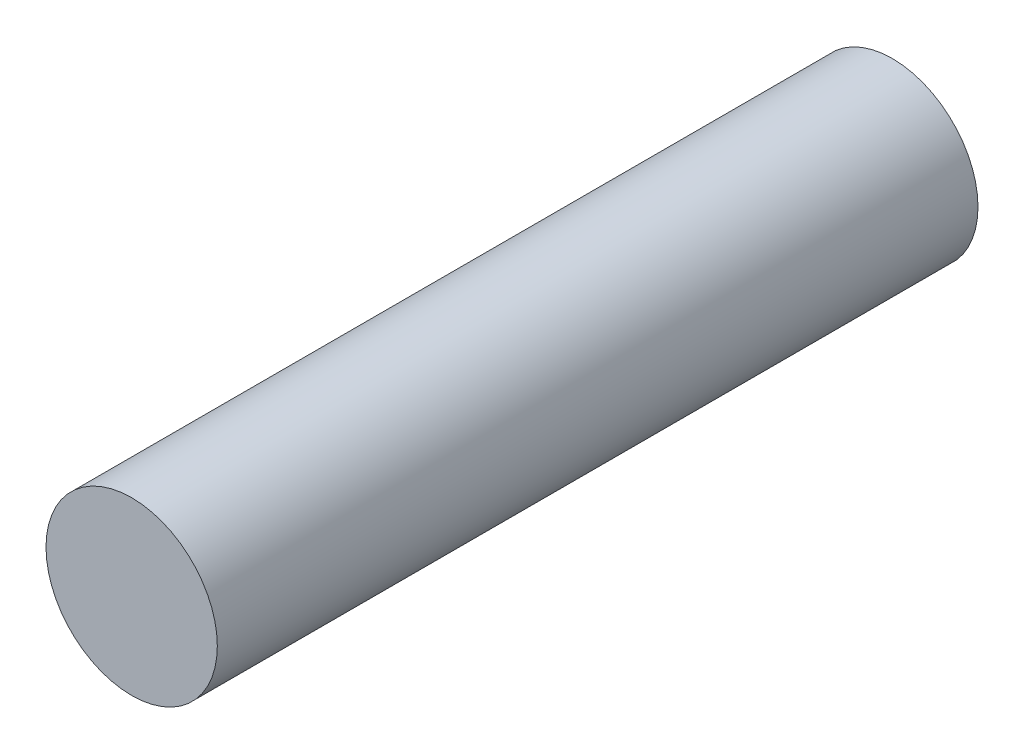
ISO-10303-21;
HEADER;
FILE_DESCRIPTION(('STEP AP214'),'2;1');
FILE_NAME('part.step','',(''),(''),'','','');
FILE_SCHEMA(('AUTOMOTIVE_DESIGN { 1 0 10303 214 1 1 1 1 }'));
ENDSEC;
DATA;
#1=APPLICATION_CONTEXT('core data for automotive mechanical design processes');
#2=APPLICATION_PROTOCOL_DEFINITION('international standard','automotive_design',2000,#1);
#3=PRODUCT_CONTEXT('',#1,'mechanical');
#4=PRODUCT('Part','Part','',(#3));
#5=PRODUCT_RELATED_PRODUCT_CATEGORY('part','',(#4));
#6=PRODUCT_DEFINITION_FORMATION('','',#4);
#7=PRODUCT_DEFINITION_CONTEXT('part definition',#1,'design');
#8=PRODUCT_DEFINITION('design','',#6,#7);
#9=PRODUCT_DEFINITION_SHAPE('','',#8);
#10=(LENGTH_UNIT() NAMED_UNIT(*) SI_UNIT(.MILLI.,.METRE.));
#11=(NAMED_UNIT(*) PLANE_ANGLE_UNIT() SI_UNIT($,.RADIAN.));
#12=(NAMED_UNIT(*) SI_UNIT($,.STERADIAN.) SOLID_ANGLE_UNIT());
#13=UNCERTAINTY_MEASURE_WITH_UNIT(LENGTH_MEASURE(1.E-05),#10,'distance_accuracy_value','');
#14=(GEOMETRIC_REPRESENTATION_CONTEXT(3) GLOBAL_UNCERTAINTY_ASSIGNED_CONTEXT((#13)) GLOBAL_UNIT_ASSIGNED_CONTEXT((#10,
#11,#12)) REPRESENTATION_CONTEXT('',''));
#15=CARTESIAN_POINT('',(0.,0.,0.));
#16=DIRECTION('',(0.,0.,1.));
#17=DIRECTION('',(1.,0.,0.));
#18=AXIS2_PLACEMENT_3D('',#15,#16,#17);
#19=CARTESIAN_POINT('',(0.,0.,111.));
#20=DIRECTION('',(0.,0.,-1.));
#21=DIRECTION('',(-1.,0.,0.));
#22=AXIS2_PLACEMENT_3D('',#19,#20,#21);
#23=CYLINDRICAL_SURFACE('',#22,12.5);
#24=CARTESIAN_POINT('',(0.,0.,111.));
#25=DIRECTION('',(0.,0.,1.));
#26=DIRECTION('',(1.,0.,0.));
#27=AXIS2_PLACEMENT_3D('',#24,#25,#26);
#28=CIRCLE('',#27,12.5);
#29=CARTESIAN_POINT('',(12.5,0.,111.));
#30=VERTEX_POINT('',#29);
#31=EDGE_CURVE('E10',#30,#30,#28,.T.);
#32=ORIENTED_EDGE('',*,*,#31,.F.);
#33=EDGE_LOOP('',(#32));
#34=FACE_BOUND('',#33,.T.);
#35=CARTESIAN_POINT('',(0.,0.,0.));
#36=DIRECTION('',(0.,0.,1.));
#37=DIRECTION('',(1.,0.,0.));
#38=AXIS2_PLACEMENT_3D('',#35,#36,#37);
#39=CIRCLE('',#38,12.5);
#40=CARTESIAN_POINT('',(12.5,0.,0.));
#41=VERTEX_POINT('',#40);
#42=EDGE_CURVE('E40',#41,#41,#39,.T.);
#43=ORIENTED_EDGE('',*,*,#42,.T.);
#44=EDGE_LOOP('',(#43));
#45=FACE_BOUND('',#44,.T.);
#46=ADVANCED_FACE('F37',(#34,#45),#23,.T.);
#47=CARTESIAN_POINT('',(0.,0.,111.));
#48=DIRECTION('',(0.,0.,1.));
#49=DIRECTION('',(1.,0.,0.));
#50=AXIS2_PLACEMENT_3D('',#47,#48,#49);
#51=PLANE('',#50);
#52=ORIENTED_EDGE('',*,*,#31,.T.);
#53=EDGE_LOOP('',(#52));
#54=FACE_BOUND('',#53,.T.);
#55=ADVANCED_FACE('F52',(#54),#51,.T.);
#56=CARTESIAN_POINT('',(0.,0.,0.));
#57=DIRECTION('',(0.,0.,1.));
#58=DIRECTION('',(1.,0.,0.));
#59=AXIS2_PLACEMENT_3D('',#56,#57,#58);
#60=PLANE('',#59);
#61=ORIENTED_EDGE('',*,*,#42,.F.);
#62=EDGE_LOOP('',(#61));
#63=FACE_BOUND('',#62,.T.);
#64=ADVANCED_FACE('F50',(#63),#60,.F.);
#65=CLOSED_SHELL('',(#46,#55,#64));
#66=MANIFOLD_SOLID_BREP('B2',#65);
#67=ADVANCED_BREP_SHAPE_REPRESENTATION('',(#18,#66),#14);
#68=SHAPE_DEFINITION_REPRESENTATION(#9,#67);
ENDSEC;
END-ISO-10303-21;
